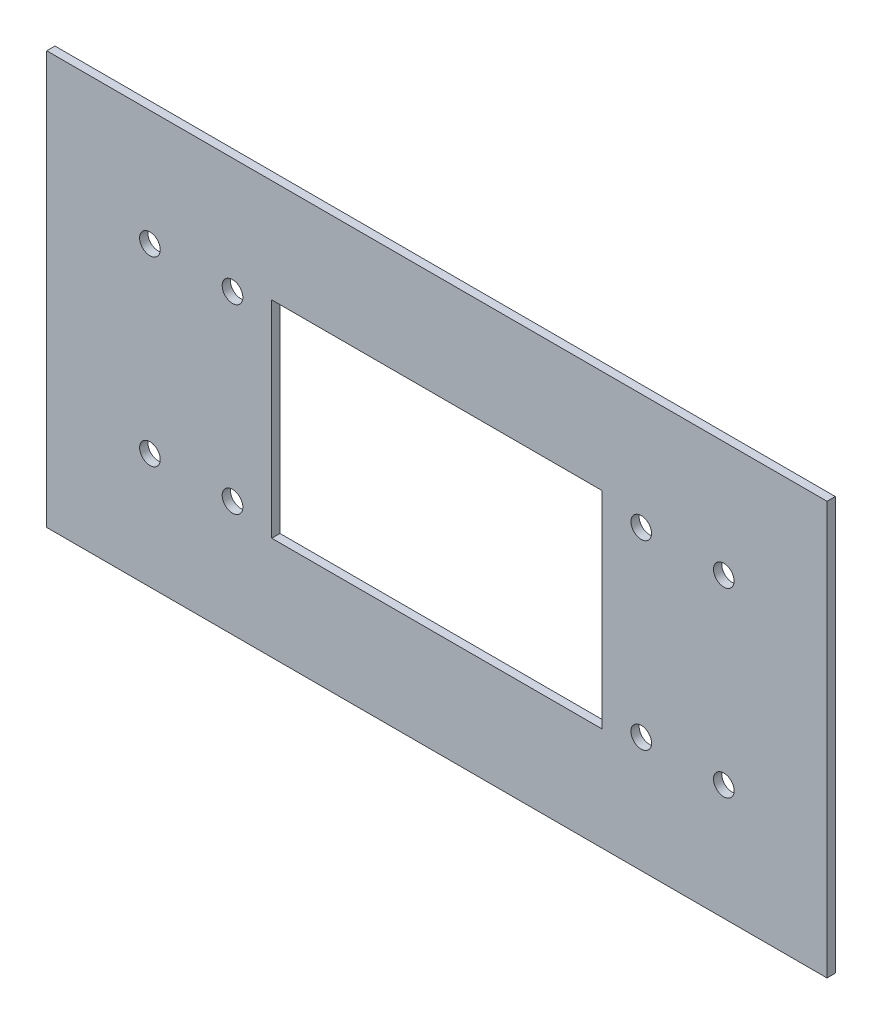
ISO-10303-21;
HEADER;
FILE_DESCRIPTION(('STEP AP214'),'2;1');
FILE_NAME('part.step','',(''),(''),'','','');
FILE_SCHEMA(('AUTOMOTIVE_DESIGN { 1 0 10303 214 1 1 1 1 }'));
ENDSEC;
DATA;
#1=APPLICATION_CONTEXT('core data for automotive mechanical design processes');
#2=APPLICATION_PROTOCOL_DEFINITION('international standard','automotive_design',2000,#1);
#3=PRODUCT_CONTEXT('',#1,'mechanical');
#4=PRODUCT('Part','Part','',(#3));
#5=PRODUCT_RELATED_PRODUCT_CATEGORY('part','',(#4));
#6=PRODUCT_DEFINITION_FORMATION('','',#4);
#7=PRODUCT_DEFINITION_CONTEXT('part definition',#1,'design');
#8=PRODUCT_DEFINITION('design','',#6,#7);
#9=PRODUCT_DEFINITION_SHAPE('','',#8);
#10=(LENGTH_UNIT() NAMED_UNIT(*) SI_UNIT(.MILLI.,.METRE.));
#11=(NAMED_UNIT(*) PLANE_ANGLE_UNIT() SI_UNIT($,.RADIAN.));
#12=(NAMED_UNIT(*) SI_UNIT($,.STERADIAN.) SOLID_ANGLE_UNIT());
#13=UNCERTAINTY_MEASURE_WITH_UNIT(LENGTH_MEASURE(1.E-05),#10,'distance_accuracy_value','');
#14=(GEOMETRIC_REPRESENTATION_CONTEXT(3) GLOBAL_UNCERTAINTY_ASSIGNED_CONTEXT((#13)) GLOBAL_UNIT_ASSIGNED_CONTEXT((#10,
#11,#12)) REPRESENTATION_CONTEXT('',''));
#15=CARTESIAN_POINT('',(0.,0.,0.));
#16=DIRECTION('',(0.,0.,1.));
#17=DIRECTION('',(1.,0.,0.));
#18=AXIS2_PLACEMENT_3D('',#15,#16,#17);
#19=CARTESIAN_POINT('',(0.,0.,2.));
#20=DIRECTION('',(0.,0.,-1.));
#21=DIRECTION('',(-1.,0.,0.));
#22=AXIS2_PLACEMENT_3D('',#19,#20,#21);
#23=PLANE('',#22);
#24=CARTESIAN_POINT('',(144.,72.,2.));
#25=DIRECTION('',(0.,0.,1.));
#26=DIRECTION('',(1.,0.,0.));
#27=AXIS2_PLACEMENT_3D('',#24,#25,#26);
#28=CIRCLE('',#27,2.5);
#29=CARTESIAN_POINT('',(146.5,72.,2.));
#30=VERTEX_POINT('',#29);
#31=EDGE_CURVE('E348',#30,#30,#28,.T.);
#32=ORIENTED_EDGE('',*,*,#31,.F.);
#33=EDGE_LOOP('',(#32));
#34=FACE_BOUND('',#33,.T.);
#35=CARTESIAN_POINT('',(45.,28.,2.));
#36=DIRECTION('',(0.,0.,1.));
#37=DIRECTION('',(1.,0.,0.));
#38=AXIS2_PLACEMENT_3D('',#35,#36,#37);
#39=CIRCLE('',#38,2.5);
#40=CARTESIAN_POINT('',(47.5,28.,2.));
#41=VERTEX_POINT('',#40);
#42=EDGE_CURVE('E346',#41,#41,#39,.T.);
#43=ORIENTED_EDGE('',*,*,#42,.F.);
#44=EDGE_LOOP('',(#43));
#45=FACE_BOUND('',#44,.T.);
#46=CARTESIAN_POINT('',(25.,28.,2.));
#47=DIRECTION('',(0.,0.,1.));
#48=DIRECTION('',(1.,0.,0.));
#49=AXIS2_PLACEMENT_3D('',#46,#47,#48);
#50=CIRCLE('',#49,2.5);
#51=CARTESIAN_POINT('',(27.5,28.,2.));
#52=VERTEX_POINT('',#51);
#53=EDGE_CURVE('E347',#52,#52,#50,.T.);
#54=ORIENTED_EDGE('',*,*,#53,.F.);
#55=EDGE_LOOP('',(#54));
#56=FACE_BOUND('',#55,.T.);
#57=CARTESIAN_POINT('',(45.,72.,2.));
#58=DIRECTION('',(0.,0.,1.));
#59=DIRECTION('',(1.,0.,0.));
#60=AXIS2_PLACEMENT_3D('',#57,#58,#59);
#61=CIRCLE('',#60,2.5);
#62=CARTESIAN_POINT('',(47.5,72.,2.));
#63=VERTEX_POINT('',#62);
#64=EDGE_CURVE('E351',#63,#63,#61,.T.);
#65=ORIENTED_EDGE('',*,*,#64,.F.);
#66=EDGE_LOOP('',(#65));
#67=FACE_BOUND('',#66,.T.);
#68=CARTESIAN_POINT('',(164.,28.,2.));
#69=DIRECTION('',(0.,0.,1.));
#70=DIRECTION('',(1.,0.,0.));
#71=AXIS2_PLACEMENT_3D('',#68,#69,#70);
#72=CIRCLE('',#71,2.5);
#73=CARTESIAN_POINT('',(166.5,28.,2.));
#74=VERTEX_POINT('',#73);
#75=EDGE_CURVE('E372',#74,#74,#72,.T.);
#76=ORIENTED_EDGE('',*,*,#75,.F.);
#77=EDGE_LOOP('',(#76));
#78=FACE_BOUND('',#77,.T.);
#79=CARTESIAN_POINT('',(144.,28.,2.));
#80=DIRECTION('',(0.,0.,1.));
#81=DIRECTION('',(1.,0.,0.));
#82=AXIS2_PLACEMENT_3D('',#79,#80,#81);
#83=CIRCLE('',#82,2.5);
#84=CARTESIAN_POINT('',(146.5,28.,2.));
#85=VERTEX_POINT('',#84);
#86=EDGE_CURVE('E357',#85,#85,#83,.T.);
#87=ORIENTED_EDGE('',*,*,#86,.F.);
#88=EDGE_LOOP('',(#87));
#89=FACE_BOUND('',#88,.T.);
#90=CARTESIAN_POINT('',(164.,72.,2.));
#91=DIRECTION('',(0.,0.,1.));
#92=DIRECTION('',(1.,0.,0.));
#93=AXIS2_PLACEMENT_3D('',#90,#91,#92);
#94=CIRCLE('',#93,2.5);
#95=CARTESIAN_POINT('',(166.5,72.,2.));
#96=VERTEX_POINT('',#95);
#97=EDGE_CURVE('E354',#96,#96,#94,.T.);
#98=ORIENTED_EDGE('',*,*,#97,.F.);
#99=EDGE_LOOP('',(#98));
#100=FACE_BOUND('',#99,.T.);
#101=CARTESIAN_POINT('',(25.,72.,2.));
#102=DIRECTION('',(0.,0.,1.));
#103=DIRECTION('',(1.,0.,0.));
#104=AXIS2_PLACEMENT_3D('',#101,#102,#103);
#105=CIRCLE('',#104,2.5);
#106=CARTESIAN_POINT('',(27.5,72.,2.));
#107=VERTEX_POINT('',#106);
#108=EDGE_CURVE('E166',#107,#107,#105,.T.);
#109=ORIENTED_EDGE('',*,*,#108,.F.);
#110=EDGE_LOOP('',(#109));
#111=FACE_BOUND('',#110,.T.);
#112=DIRECTION('',(0.,-1.,0.));
#113=VECTOR('',#112,1.);
#114=CARTESIAN_POINT('',(0.,0.,2.));
#115=LINE('',#114,#113);
#116=CARTESIAN_POINT('',(0.,100.,2.));
#117=VERTEX_POINT('',#116);
#118=CARTESIAN_POINT('',(0.,0.,2.));
#119=VERTEX_POINT('',#118);
#120=EDGE_CURVE('E137',#117,#119,#115,.T.);
#121=ORIENTED_EDGE('',*,*,#120,.T.);
#122=DIRECTION('',(1.,0.,0.));
#123=VECTOR('',#122,1.);
#124=CARTESIAN_POINT('',(0.,0.,2.));
#125=LINE('',#124,#123);
#126=CARTESIAN_POINT('',(189.,0.,2.));
#127=VERTEX_POINT('',#126);
#128=EDGE_CURVE('E140',#119,#127,#125,.T.);
#129=ORIENTED_EDGE('',*,*,#128,.T.);
#130=DIRECTION('',(0.,1.,0.));
#131=VECTOR('',#130,1.);
#132=CARTESIAN_POINT('',(189.,0.,2.));
#133=LINE('',#132,#131);
#134=CARTESIAN_POINT('',(189.,100.,2.));
#135=VERTEX_POINT('',#134);
#136=EDGE_CURVE('E143',#127,#135,#133,.T.);
#137=ORIENTED_EDGE('',*,*,#136,.T.);
#138=DIRECTION('',(-1.,0.,0.));
#139=VECTOR('',#138,1.);
#140=CARTESIAN_POINT('',(0.,100.,2.));
#141=LINE('',#140,#139);
#142=EDGE_CURVE('E145',#135,#117,#141,.T.);
#143=ORIENTED_EDGE('',*,*,#142,.T.);
#144=EDGE_LOOP('',(#121,#129,#137,#143));
#145=FACE_BOUND('',#144,.T.);
#146=DIRECTION('',(0.,-1.,0.));
#147=VECTOR('',#146,1.);
#148=CARTESIAN_POINT('',(54.5,75.,2.));
#149=LINE('',#148,#147);
#150=CARTESIAN_POINT('',(54.5,75.,2.));
#151=VERTEX_POINT('',#150);
#152=CARTESIAN_POINT('',(54.5,25.,2.));
#153=VERTEX_POINT('',#152);
#154=EDGE_CURVE('E100',#151,#153,#149,.T.);
#155=ORIENTED_EDGE('',*,*,#154,.F.);
#156=DIRECTION('',(-1.,0.,0.));
#157=VECTOR('',#156,1.);
#158=CARTESIAN_POINT('',(54.5,75.,2.));
#159=LINE('',#158,#157);
#160=CARTESIAN_POINT('',(134.5,75.,2.));
#161=VERTEX_POINT('',#160);
#162=EDGE_CURVE('E122',#161,#151,#159,.T.);
#163=ORIENTED_EDGE('',*,*,#162,.F.);
#164=DIRECTION('',(0.,1.,0.));
#165=VECTOR('',#164,1.);
#166=CARTESIAN_POINT('',(134.5,75.,2.));
#167=LINE('',#166,#165);
#168=CARTESIAN_POINT('',(134.5,25.,2.));
#169=VERTEX_POINT('',#168);
#170=EDGE_CURVE('E120',#169,#161,#167,.T.);
#171=ORIENTED_EDGE('',*,*,#170,.F.);
#172=DIRECTION('',(1.,0.,0.));
#173=VECTOR('',#172,1.);
#174=CARTESIAN_POINT('',(54.5,25.,2.));
#175=LINE('',#174,#173);
#176=EDGE_CURVE('E108',#153,#169,#175,.T.);
#177=ORIENTED_EDGE('',*,*,#176,.F.);
#178=EDGE_LOOP('',(#155,#163,#171,#177));
#179=FACE_BOUND('',#178,.T.);
#180=ADVANCED_FACE('F33',(#34,#45,#56,#67,#78,#89,#100,#111,#145,#179),#23,.F.);
#181=CARTESIAN_POINT('',(0.,0.,0.));
#182=DIRECTION('',(0.,0.,-1.));
#183=DIRECTION('',(-1.,0.,0.));
#184=AXIS2_PLACEMENT_3D('',#181,#182,#183);
#185=PLANE('',#184);
#186=CARTESIAN_POINT('',(144.,72.,0.));
#187=DIRECTION('',(0.,0.,-1.));
#188=DIRECTION('',(-1.,0.,0.));
#189=AXIS2_PLACEMENT_3D('',#186,#187,#188);
#190=CIRCLE('',#189,2.5);
#191=CARTESIAN_POINT('',(141.5,72.,0.));
#192=VERTEX_POINT('',#191);
#193=EDGE_CURVE('E37',#192,#192,#190,.T.);
#194=ORIENTED_EDGE('',*,*,#193,.F.);
#195=EDGE_LOOP('',(#194));
#196=FACE_BOUND('',#195,.T.);
#197=CARTESIAN_POINT('',(45.,28.,0.));
#198=DIRECTION('',(0.,0.,-1.));
#199=DIRECTION('',(-1.,0.,0.));
#200=AXIS2_PLACEMENT_3D('',#197,#198,#199);
#201=CIRCLE('',#200,2.5);
#202=CARTESIAN_POINT('',(42.5,28.,0.));
#203=VERTEX_POINT('',#202);
#204=EDGE_CURVE('E180',#203,#203,#201,.T.);
#205=ORIENTED_EDGE('',*,*,#204,.F.);
#206=EDGE_LOOP('',(#205));
#207=FACE_BOUND('',#206,.T.);
#208=CARTESIAN_POINT('',(25.,28.,0.));
#209=DIRECTION('',(0.,0.,-1.));
#210=DIRECTION('',(-1.,0.,0.));
#211=AXIS2_PLACEMENT_3D('',#208,#209,#210);
#212=CIRCLE('',#211,2.5);
#213=CARTESIAN_POINT('',(22.5,28.,0.));
#214=VERTEX_POINT('',#213);
#215=EDGE_CURVE('E178',#214,#214,#212,.T.);
#216=ORIENTED_EDGE('',*,*,#215,.F.);
#217=EDGE_LOOP('',(#216));
#218=FACE_BOUND('',#217,.T.);
#219=CARTESIAN_POINT('',(45.,72.,0.));
#220=DIRECTION('',(0.,0.,-1.));
#221=DIRECTION('',(-1.,0.,0.));
#222=AXIS2_PLACEMENT_3D('',#219,#220,#221);
#223=CIRCLE('',#222,2.5);
#224=CARTESIAN_POINT('',(42.5,72.,0.));
#225=VERTEX_POINT('',#224);
#226=EDGE_CURVE('E175',#225,#225,#223,.T.);
#227=ORIENTED_EDGE('',*,*,#226,.F.);
#228=EDGE_LOOP('',(#227));
#229=FACE_BOUND('',#228,.T.);
#230=CARTESIAN_POINT('',(164.,28.,0.));
#231=DIRECTION('',(0.,0.,-1.));
#232=DIRECTION('',(-1.,0.,0.));
#233=AXIS2_PLACEMENT_3D('',#230,#231,#232);
#234=CIRCLE('',#233,2.5);
#235=CARTESIAN_POINT('',(161.5,28.,0.));
#236=VERTEX_POINT('',#235);
#237=EDGE_CURVE('E172',#236,#236,#234,.T.);
#238=ORIENTED_EDGE('',*,*,#237,.F.);
#239=EDGE_LOOP('',(#238));
#240=FACE_BOUND('',#239,.T.);
#241=CARTESIAN_POINT('',(144.,28.,0.));
#242=DIRECTION('',(0.,0.,-1.));
#243=DIRECTION('',(-1.,0.,0.));
#244=AXIS2_PLACEMENT_3D('',#241,#242,#243);
#245=CIRCLE('',#244,2.5);
#246=CARTESIAN_POINT('',(141.5,28.,0.));
#247=VERTEX_POINT('',#246);
#248=EDGE_CURVE('E169',#247,#247,#245,.T.);
#249=ORIENTED_EDGE('',*,*,#248,.F.);
#250=EDGE_LOOP('',(#249));
#251=FACE_BOUND('',#250,.T.);
#252=CARTESIAN_POINT('',(164.,72.,0.));
#253=DIRECTION('',(0.,0.,-1.));
#254=DIRECTION('',(-1.,0.,0.));
#255=AXIS2_PLACEMENT_3D('',#252,#253,#254);
#256=CIRCLE('',#255,2.5);
#257=CARTESIAN_POINT('',(161.5,72.,0.));
#258=VERTEX_POINT('',#257);
#259=EDGE_CURVE('E165',#258,#258,#256,.T.);
#260=ORIENTED_EDGE('',*,*,#259,.F.);
#261=EDGE_LOOP('',(#260));
#262=FACE_BOUND('',#261,.T.);
#263=CARTESIAN_POINT('',(25.,72.,0.));
#264=DIRECTION('',(0.,0.,-1.));
#265=DIRECTION('',(-1.,0.,0.));
#266=AXIS2_PLACEMENT_3D('',#263,#264,#265);
#267=CIRCLE('',#266,2.5);
#268=CARTESIAN_POINT('',(22.5,72.,0.));
#269=VERTEX_POINT('',#268);
#270=EDGE_CURVE('E162',#269,#269,#267,.T.);
#271=ORIENTED_EDGE('',*,*,#270,.F.);
#272=EDGE_LOOP('',(#271));
#273=FACE_BOUND('',#272,.T.);
#274=DIRECTION('',(0.,-1.,0.));
#275=VECTOR('',#274,1.);
#276=CARTESIAN_POINT('',(0.,0.,0.));
#277=LINE('',#276,#275);
#278=CARTESIAN_POINT('',(0.,100.,0.));
#279=VERTEX_POINT('',#278);
#280=CARTESIAN_POINT('',(0.,0.,0.));
#281=VERTEX_POINT('',#280);
#282=EDGE_CURVE('E116',#279,#281,#277,.T.);
#283=ORIENTED_EDGE('',*,*,#282,.F.);
#284=DIRECTION('',(-1.,0.,0.));
#285=VECTOR('',#284,1.);
#286=CARTESIAN_POINT('',(0.,100.,0.));
#287=LINE('',#286,#285);
#288=CARTESIAN_POINT('',(189.,100.,0.));
#289=VERTEX_POINT('',#288);
#290=EDGE_CURVE('E141',#289,#279,#287,.T.);
#291=ORIENTED_EDGE('',*,*,#290,.F.);
#292=DIRECTION('',(0.,1.,0.));
#293=VECTOR('',#292,1.);
#294=CARTESIAN_POINT('',(189.,0.,0.));
#295=LINE('',#294,#293);
#296=CARTESIAN_POINT('',(189.,0.,0.));
#297=VERTEX_POINT('',#296);
#298=EDGE_CURVE('E152',#297,#289,#295,.T.);
#299=ORIENTED_EDGE('',*,*,#298,.F.);
#300=DIRECTION('',(1.,0.,0.));
#301=VECTOR('',#300,1.);
#302=CARTESIAN_POINT('',(0.,0.,0.));
#303=LINE('',#302,#301);
#304=EDGE_CURVE('E150',#281,#297,#303,.T.);
#305=ORIENTED_EDGE('',*,*,#304,.F.);
#306=EDGE_LOOP('',(#283,#291,#299,#305));
#307=FACE_BOUND('',#306,.T.);
#308=DIRECTION('',(-1.,0.,0.));
#309=VECTOR('',#308,1.);
#310=CARTESIAN_POINT('',(54.5,75.,0.));
#311=LINE('',#310,#309);
#312=CARTESIAN_POINT('',(134.5,75.,0.));
#313=VERTEX_POINT('',#312);
#314=CARTESIAN_POINT('',(54.5,75.,0.));
#315=VERTEX_POINT('',#314);
#316=EDGE_CURVE('E109',#313,#315,#311,.T.);
#317=ORIENTED_EDGE('',*,*,#316,.T.);
#318=DIRECTION('',(0.,-1.,0.));
#319=VECTOR('',#318,1.);
#320=CARTESIAN_POINT('',(54.5,75.,0.));
#321=LINE('',#320,#319);
#322=CARTESIAN_POINT('',(54.5,25.,0.));
#323=VERTEX_POINT('',#322);
#324=EDGE_CURVE('E58',#315,#323,#321,.T.);
#325=ORIENTED_EDGE('',*,*,#324,.T.);
#326=DIRECTION('',(1.,0.,0.));
#327=VECTOR('',#326,1.);
#328=CARTESIAN_POINT('',(54.5,25.,0.));
#329=LINE('',#328,#327);
#330=CARTESIAN_POINT('',(134.5,25.,0.));
#331=VERTEX_POINT('',#330);
#332=EDGE_CURVE('E115',#323,#331,#329,.T.);
#333=ORIENTED_EDGE('',*,*,#332,.T.);
#334=DIRECTION('',(0.,1.,0.));
#335=VECTOR('',#334,1.);
#336=CARTESIAN_POINT('',(134.5,75.,0.));
#337=LINE('',#336,#335);
#338=EDGE_CURVE('E129',#331,#313,#337,.T.);
#339=ORIENTED_EDGE('',*,*,#338,.T.);
#340=EDGE_LOOP('',(#317,#325,#333,#339));
#341=FACE_BOUND('',#340,.T.);
#342=ADVANCED_FACE('F190',(#196,#207,#218,#229,#240,#251,#262,#273,#307,#341),#185,.T.);
#343=CARTESIAN_POINT('',(0.,0.,2.));
#344=DIRECTION('',(1.,0.,0.));
#345=DIRECTION('',(0.,0.,-1.));
#346=AXIS2_PLACEMENT_3D('',#343,#344,#345);
#347=PLANE('',#346);
#348=ORIENTED_EDGE('',*,*,#282,.T.);
#349=DIRECTION('',(0.,0.,-1.));
#350=VECTOR('',#349,1.);
#351=CARTESIAN_POINT('',(0.,0.,2.));
#352=LINE('',#351,#350);
#353=EDGE_CURVE('E11',#119,#281,#352,.T.);
#354=ORIENTED_EDGE('',*,*,#353,.F.);
#355=ORIENTED_EDGE('',*,*,#120,.F.);
#356=DIRECTION('',(0.,0.,-1.));
#357=VECTOR('',#356,1.);
#358=CARTESIAN_POINT('',(0.,100.,2.));
#359=LINE('',#358,#357);
#360=EDGE_CURVE('E147',#117,#279,#359,.T.);
#361=ORIENTED_EDGE('',*,*,#360,.T.);
#362=EDGE_LOOP('',(#348,#354,#355,#361));
#363=FACE_BOUND('',#362,.T.);
#364=ADVANCED_FACE('F35',(#363),#347,.F.);
#365=CARTESIAN_POINT('',(0.,0.,2.));
#366=DIRECTION('',(0.,1.,0.));
#367=DIRECTION('',(0.,0.,1.));
#368=AXIS2_PLACEMENT_3D('',#365,#366,#367);
#369=PLANE('',#368);
#370=ORIENTED_EDGE('',*,*,#304,.T.);
#371=DIRECTION('',(0.,0.,-1.));
#372=VECTOR('',#371,1.);
#373=CARTESIAN_POINT('',(189.,0.,2.));
#374=LINE('',#373,#372);
#375=EDGE_CURVE('E42',#127,#297,#374,.T.);
#376=ORIENTED_EDGE('',*,*,#375,.F.);
#377=ORIENTED_EDGE('',*,*,#128,.F.);
#378=ORIENTED_EDGE('',*,*,#353,.T.);
#379=EDGE_LOOP('',(#370,#376,#377,#378));
#380=FACE_BOUND('',#379,.T.);
#381=ADVANCED_FACE('F241',(#380),#369,.F.);
#382=CARTESIAN_POINT('',(189.,0.,2.));
#383=DIRECTION('',(-1.,0.,0.));
#384=DIRECTION('',(0.,0.,1.));
#385=AXIS2_PLACEMENT_3D('',#382,#383,#384);
#386=PLANE('',#385);
#387=ORIENTED_EDGE('',*,*,#298,.T.);
#388=DIRECTION('',(0.,0.,-1.));
#389=VECTOR('',#388,1.);
#390=CARTESIAN_POINT('',(189.,100.,2.));
#391=LINE('',#390,#389);
#392=EDGE_CURVE('E157',#135,#289,#391,.T.);
#393=ORIENTED_EDGE('',*,*,#392,.F.);
#394=ORIENTED_EDGE('',*,*,#136,.F.);
#395=ORIENTED_EDGE('',*,*,#375,.T.);
#396=EDGE_LOOP('',(#387,#393,#394,#395));
#397=FACE_BOUND('',#396,.T.);
#398=ADVANCED_FACE('F238',(#397),#386,.F.);
#399=CARTESIAN_POINT('',(0.,100.,2.));
#400=DIRECTION('',(0.,-1.,0.));
#401=DIRECTION('',(0.,0.,-1.));
#402=AXIS2_PLACEMENT_3D('',#399,#400,#401);
#403=PLANE('',#402);
#404=ORIENTED_EDGE('',*,*,#290,.T.);
#405=ORIENTED_EDGE('',*,*,#360,.F.);
#406=ORIENTED_EDGE('',*,*,#142,.F.);
#407=ORIENTED_EDGE('',*,*,#392,.T.);
#408=EDGE_LOOP('',(#404,#405,#406,#407));
#409=FACE_BOUND('',#408,.T.);
#410=ADVANCED_FACE('F235',(#409),#403,.F.);
#411=CARTESIAN_POINT('',(54.5,75.,2.));
#412=DIRECTION('',(1.,0.,0.));
#413=DIRECTION('',(0.,1.,0.));
#414=AXIS2_PLACEMENT_3D('',#411,#412,#413);
#415=PLANE('',#414);
#416=ORIENTED_EDGE('',*,*,#324,.F.);
#417=DIRECTION('',(0.,0.,-1.));
#418=VECTOR('',#417,1.);
#419=CARTESIAN_POINT('',(54.5,75.,2.));
#420=LINE('',#419,#418);
#421=EDGE_CURVE('E104',#151,#315,#420,.T.);
#422=ORIENTED_EDGE('',*,*,#421,.F.);
#423=ORIENTED_EDGE('',*,*,#154,.T.);
#424=DIRECTION('',(0.,0.,-1.));
#425=VECTOR('',#424,1.);
#426=CARTESIAN_POINT('',(54.5,25.,2.));
#427=LINE('',#426,#425);
#428=EDGE_CURVE('E103',#153,#323,#427,.T.);
#429=ORIENTED_EDGE('',*,*,#428,.T.);
#430=EDGE_LOOP('',(#416,#422,#423,#429));
#431=FACE_BOUND('',#430,.T.);
#432=ADVANCED_FACE('F102',(#431),#415,.T.);
#433=CARTESIAN_POINT('',(54.5,25.,2.));
#434=DIRECTION('',(0.,1.,0.));
#435=DIRECTION('',(0.,0.,1.));
#436=AXIS2_PLACEMENT_3D('',#433,#434,#435);
#437=PLANE('',#436);
#438=ORIENTED_EDGE('',*,*,#332,.F.);
#439=ORIENTED_EDGE('',*,*,#428,.F.);
#440=ORIENTED_EDGE('',*,*,#176,.T.);
#441=DIRECTION('',(0.,0.,-1.));
#442=VECTOR('',#441,1.);
#443=CARTESIAN_POINT('',(134.5,25.,2.));
#444=LINE('',#443,#442);
#445=EDGE_CURVE('E117',#169,#331,#444,.T.);
#446=ORIENTED_EDGE('',*,*,#445,.T.);
#447=EDGE_LOOP('',(#438,#439,#440,#446));
#448=FACE_BOUND('',#447,.T.);
#449=ADVANCED_FACE('F112',(#448),#437,.T.);
#450=CARTESIAN_POINT('',(134.5,75.,2.));
#451=DIRECTION('',(-1.,0.,0.));
#452=DIRECTION('',(0.,0.,1.));
#453=AXIS2_PLACEMENT_3D('',#450,#451,#452);
#454=PLANE('',#453);
#455=ORIENTED_EDGE('',*,*,#338,.F.);
#456=ORIENTED_EDGE('',*,*,#445,.F.);
#457=ORIENTED_EDGE('',*,*,#170,.T.);
#458=DIRECTION('',(0.,0.,-1.));
#459=VECTOR('',#458,1.);
#460=CARTESIAN_POINT('',(134.5,75.,2.));
#461=LINE('',#460,#459);
#462=EDGE_CURVE('E50',#161,#313,#461,.T.);
#463=ORIENTED_EDGE('',*,*,#462,.T.);
#464=EDGE_LOOP('',(#455,#456,#457,#463));
#465=FACE_BOUND('',#464,.T.);
#466=ADVANCED_FACE('F214',(#465),#454,.T.);
#467=CARTESIAN_POINT('',(54.5,75.,2.));
#468=DIRECTION('',(0.,-1.,0.));
#469=DIRECTION('',(0.,0.,-1.));
#470=AXIS2_PLACEMENT_3D('',#467,#468,#469);
#471=PLANE('',#470);
#472=ORIENTED_EDGE('',*,*,#316,.F.);
#473=ORIENTED_EDGE('',*,*,#462,.F.);
#474=ORIENTED_EDGE('',*,*,#162,.T.);
#475=ORIENTED_EDGE('',*,*,#421,.T.);
#476=EDGE_LOOP('',(#472,#473,#474,#475));
#477=FACE_BOUND('',#476,.T.);
#478=ADVANCED_FACE('F211',(#477),#471,.T.);
#479=CARTESIAN_POINT('',(25.,72.,-8.));
#480=DIRECTION('',(0.,0.,1.));
#481=DIRECTION('',(1.,0.,0.));
#482=AXIS2_PLACEMENT_3D('',#479,#480,#481);
#483=CYLINDRICAL_SURFACE('',#482,2.5);
#484=ORIENTED_EDGE('',*,*,#270,.T.);
#485=EDGE_LOOP('',(#484));
#486=FACE_BOUND('',#485,.T.);
#487=ORIENTED_EDGE('',*,*,#108,.T.);
#488=EDGE_LOOP('',(#487));
#489=FACE_BOUND('',#488,.T.);
#490=ADVANCED_FACE('F213',(#486,#489),#483,.F.);
#491=CARTESIAN_POINT('',(164.,72.,-8.));
#492=DIRECTION('',(0.,0.,1.));
#493=DIRECTION('',(1.,0.,0.));
#494=AXIS2_PLACEMENT_3D('',#491,#492,#493);
#495=CYLINDRICAL_SURFACE('',#494,2.5);
#496=ORIENTED_EDGE('',*,*,#259,.T.);
#497=EDGE_LOOP('',(#496));
#498=FACE_BOUND('',#497,.T.);
#499=ORIENTED_EDGE('',*,*,#97,.T.);
#500=EDGE_LOOP('',(#499));
#501=FACE_BOUND('',#500,.T.);
#502=ADVANCED_FACE('F220',(#498,#501),#495,.F.);
#503=CARTESIAN_POINT('',(144.,28.,-8.));
#504=DIRECTION('',(0.,0.,1.));
#505=DIRECTION('',(1.,0.,0.));
#506=AXIS2_PLACEMENT_3D('',#503,#504,#505);
#507=CYLINDRICAL_SURFACE('',#506,2.5);
#508=ORIENTED_EDGE('',*,*,#248,.T.);
#509=EDGE_LOOP('',(#508));
#510=FACE_BOUND('',#509,.T.);
#511=ORIENTED_EDGE('',*,*,#86,.T.);
#512=EDGE_LOOP('',(#511));
#513=FACE_BOUND('',#512,.T.);
#514=ADVANCED_FACE('F282',(#510,#513),#507,.F.);
#515=CARTESIAN_POINT('',(164.,28.,-8.));
#516=DIRECTION('',(0.,0.,1.));
#517=DIRECTION('',(1.,0.,0.));
#518=AXIS2_PLACEMENT_3D('',#515,#516,#517);
#519=CYLINDRICAL_SURFACE('',#518,2.5);
#520=ORIENTED_EDGE('',*,*,#237,.T.);
#521=EDGE_LOOP('',(#520));
#522=FACE_BOUND('',#521,.T.);
#523=ORIENTED_EDGE('',*,*,#75,.T.);
#524=EDGE_LOOP('',(#523));
#525=FACE_BOUND('',#524,.T.);
#526=ADVANCED_FACE('F292',(#522,#525),#519,.F.);
#527=CARTESIAN_POINT('',(45.,72.,-8.));
#528=DIRECTION('',(0.,0.,1.));
#529=DIRECTION('',(1.,0.,0.));
#530=AXIS2_PLACEMENT_3D('',#527,#528,#529);
#531=CYLINDRICAL_SURFACE('',#530,2.5);
#532=ORIENTED_EDGE('',*,*,#226,.T.);
#533=EDGE_LOOP('',(#532));
#534=FACE_BOUND('',#533,.T.);
#535=ORIENTED_EDGE('',*,*,#64,.T.);
#536=EDGE_LOOP('',(#535));
#537=FACE_BOUND('',#536,.T.);
#538=ADVANCED_FACE('F302',(#534,#537),#531,.F.);
#539=CARTESIAN_POINT('',(25.,28.,-8.));
#540=DIRECTION('',(0.,0.,1.));
#541=DIRECTION('',(1.,0.,0.));
#542=AXIS2_PLACEMENT_3D('',#539,#540,#541);
#543=CYLINDRICAL_SURFACE('',#542,2.5);
#544=ORIENTED_EDGE('',*,*,#215,.T.);
#545=EDGE_LOOP('',(#544));
#546=FACE_BOUND('',#545,.T.);
#547=ORIENTED_EDGE('',*,*,#53,.T.);
#548=EDGE_LOOP('',(#547));
#549=FACE_BOUND('',#548,.T.);
#550=ADVANCED_FACE('F312',(#546,#549),#543,.F.);
#551=CARTESIAN_POINT('',(45.,28.,-8.));
#552=DIRECTION('',(0.,0.,1.));
#553=DIRECTION('',(1.,0.,0.));
#554=AXIS2_PLACEMENT_3D('',#551,#552,#553);
#555=CYLINDRICAL_SURFACE('',#554,2.5);
#556=ORIENTED_EDGE('',*,*,#204,.T.);
#557=EDGE_LOOP('',(#556));
#558=FACE_BOUND('',#557,.T.);
#559=ORIENTED_EDGE('',*,*,#42,.T.);
#560=EDGE_LOOP('',(#559));
#561=FACE_BOUND('',#560,.T.);
#562=ADVANCED_FACE('F322',(#558,#561),#555,.F.);
#563=CARTESIAN_POINT('',(144.,72.,-8.));
#564=DIRECTION('',(0.,0.,1.));
#565=DIRECTION('',(1.,0.,0.));
#566=AXIS2_PLACEMENT_3D('',#563,#564,#565);
#567=CYLINDRICAL_SURFACE('',#566,2.5);
#568=ORIENTED_EDGE('',*,*,#193,.T.);
#569=EDGE_LOOP('',(#568));
#570=FACE_BOUND('',#569,.T.);
#571=ORIENTED_EDGE('',*,*,#31,.T.);
#572=EDGE_LOOP('',(#571));
#573=FACE_BOUND('',#572,.T.);
#574=ADVANCED_FACE('F187',(#570,#573),#567,.F.);
#575=CLOSED_SHELL('',(#180,#342,#364,#381,#398,#410,#432,#449,#466,#478,#490,#502,#514,#526,
#538,#550,#562,#574));
#576=MANIFOLD_SOLID_BREP('B2',#575);
#577=ADVANCED_BREP_SHAPE_REPRESENTATION('',(#18,#576),#14);
#578=SHAPE_DEFINITION_REPRESENTATION(#9,#577);
ENDSEC;
END-ISO-10303-21;
